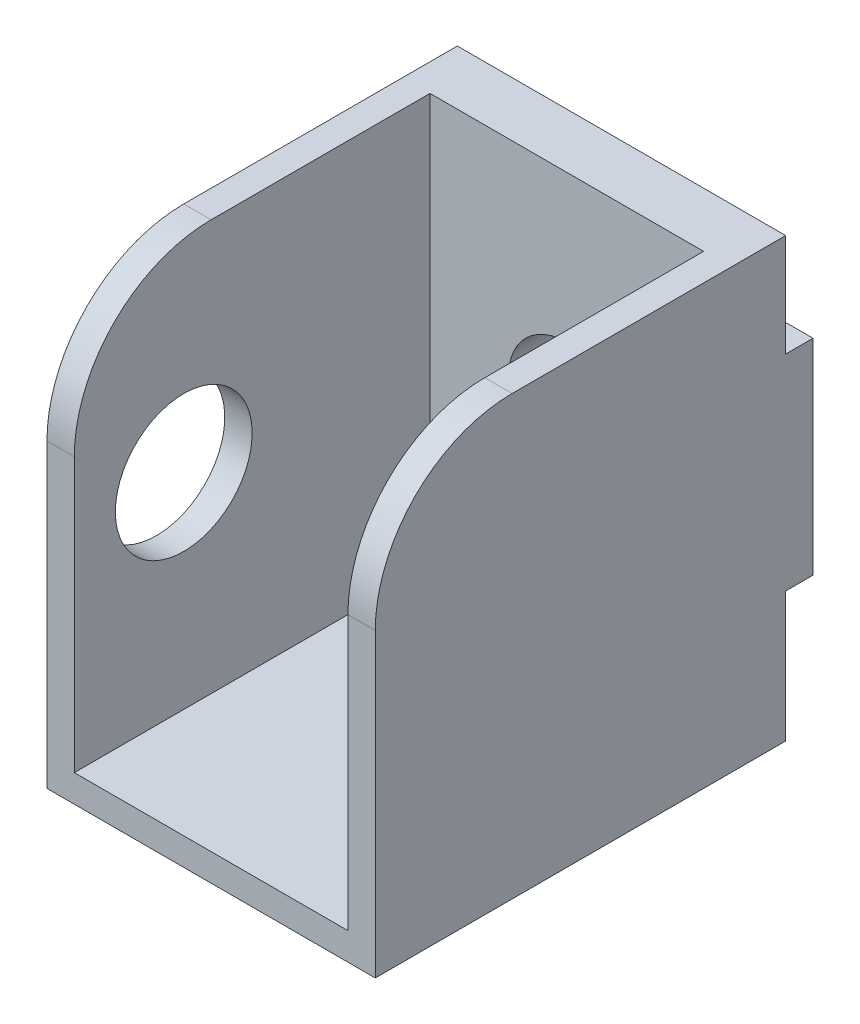
ISO-10303-21;
HEADER;
FILE_DESCRIPTION(('STEP AP214'),'2;1');
FILE_NAME('part.step','',(''),(''),'','','');
FILE_SCHEMA(('AUTOMOTIVE_DESIGN { 1 0 10303 214 1 1 1 1 }'));
ENDSEC;
DATA;
#1=APPLICATION_CONTEXT('core data for automotive mechanical design processes');
#2=APPLICATION_PROTOCOL_DEFINITION('international standard','automotive_design',2000,#1);
#3=PRODUCT_CONTEXT('',#1,'mechanical');
#4=PRODUCT('Part','Part','',(#3));
#5=PRODUCT_RELATED_PRODUCT_CATEGORY('part','',(#4));
#6=PRODUCT_DEFINITION_FORMATION('','',#4);
#7=PRODUCT_DEFINITION_CONTEXT('part definition',#1,'design');
#8=PRODUCT_DEFINITION('design','',#6,#7);
#9=PRODUCT_DEFINITION_SHAPE('','',#8);
#10=(LENGTH_UNIT() NAMED_UNIT(*) SI_UNIT(.MILLI.,.METRE.));
#11=(NAMED_UNIT(*) PLANE_ANGLE_UNIT() SI_UNIT($,.RADIAN.));
#12=(NAMED_UNIT(*) SI_UNIT($,.STERADIAN.) SOLID_ANGLE_UNIT());
#13=UNCERTAINTY_MEASURE_WITH_UNIT(LENGTH_MEASURE(1.E-05),#10,'distance_accuracy_value','');
#14=(GEOMETRIC_REPRESENTATION_CONTEXT(3) GLOBAL_UNCERTAINTY_ASSIGNED_CONTEXT((#13)) GLOBAL_UNIT_ASSIGNED_CONTEXT((#10,
#11,#12)) REPRESENTATION_CONTEXT('',''));
#15=CARTESIAN_POINT('',(0.,0.,0.));
#16=DIRECTION('',(0.,0.,1.));
#17=DIRECTION('',(1.,0.,0.));
#18=AXIS2_PLACEMENT_3D('',#15,#16,#17);
#19=CARTESIAN_POINT('',(0.,0.,0.));
#20=DIRECTION('',(0.,0.,-1.));
#21=DIRECTION('',(-1.,0.,0.));
#22=AXIS2_PLACEMENT_3D('',#19,#20,#21);
#23=PLANE('',#22);
#24=CARTESIAN_POINT('',(0.,0.,0.));
#25=DIRECTION('',(0.,0.,1.));
#26=DIRECTION('',(1.,0.,0.));
#27=AXIS2_PLACEMENT_3D('',#24,#25,#26);
#28=CIRCLE('',#27,4.25);
#29=CARTESIAN_POINT('',(4.25,0.,0.));
#30=VERTEX_POINT('',#29);
#31=EDGE_CURVE('E279',#30,#30,#28,.T.);
#32=ORIENTED_EDGE('',*,*,#31,.T.);
#33=EDGE_LOOP('',(#32));
#34=FACE_BOUND('',#33,.T.);
#35=DIRECTION('',(0.,-1.,0.));
#36=VECTOR('',#35,1.);
#37=CARTESIAN_POINT('',(-12.,15.,0.));
#38=LINE('',#37,#36);
#39=CARTESIAN_POINT('',(-12.,-7.50000000000001,0.));
#40=VERTEX_POINT('',#39);
#41=CARTESIAN_POINT('',(-12.,-17.,0.));
#42=VERTEX_POINT('',#41);
#43=EDGE_CURVE('E251',#40,#42,#38,.T.);
#44=ORIENTED_EDGE('',*,*,#43,.F.);
#45=DIRECTION('',(-1.,0.,0.));
#46=VECTOR('',#45,1.);
#47=CARTESIAN_POINT('',(-10.,-7.50000000000001,0.));
#48=LINE('',#47,#46);
#49=CARTESIAN_POINT('',(-10.,-7.50000000000001,0.));
#50=VERTEX_POINT('',#49);
#51=EDGE_CURVE('E342',#50,#40,#48,.T.);
#52=ORIENTED_EDGE('',*,*,#51,.F.);
#53=DIRECTION('',(0.,-1.,0.));
#54=VECTOR('',#53,1.);
#55=CARTESIAN_POINT('',(-10.,-7.50000000000001,0.));
#56=LINE('',#55,#54);
#57=CARTESIAN_POINT('',(-10.,7.49999999999999,0.));
#58=VERTEX_POINT('',#57);
#59=EDGE_CURVE('E179',#58,#50,#56,.T.);
#60=ORIENTED_EDGE('',*,*,#59,.F.);
#61=DIRECTION('',(1.,0.,0.));
#62=VECTOR('',#61,1.);
#63=CARTESIAN_POINT('',(-10.,7.49999999999999,0.));
#64=LINE('',#63,#62);
#65=CARTESIAN_POINT('',(-12.,7.49999999999999,0.));
#66=VERTEX_POINT('',#65);
#67=EDGE_CURVE('E175',#66,#58,#64,.T.);
#68=ORIENTED_EDGE('',*,*,#67,.F.);
#69=CARTESIAN_POINT('',(-12.,15.,0.));
#70=VERTEX_POINT('',#69);
#71=EDGE_CURVE('E247',#70,#66,#38,.T.);
#72=ORIENTED_EDGE('',*,*,#71,.F.);
#73=DIRECTION('',(-1.,0.,0.));
#74=VECTOR('',#73,1.);
#75=CARTESIAN_POINT('',(-10.,15.,0.));
#76=LINE('',#75,#74);
#77=CARTESIAN_POINT('',(12.,15.,0.));
#78=VERTEX_POINT('',#77);
#79=EDGE_CURVE('E37',#78,#70,#76,.T.);
#80=ORIENTED_EDGE('',*,*,#79,.F.);
#81=DIRECTION('',(0.,1.,0.));
#82=VECTOR('',#81,1.);
#83=CARTESIAN_POINT('',(12.,15.,0.));
#84=LINE('',#83,#82);
#85=CARTESIAN_POINT('',(12.,7.49999999999999,0.));
#86=VERTEX_POINT('',#85);
#87=EDGE_CURVE('E218',#86,#78,#84,.T.);
#88=ORIENTED_EDGE('',*,*,#87,.F.);
#89=DIRECTION('',(1.,0.,0.));
#90=VECTOR('',#89,1.);
#91=CARTESIAN_POINT('',(10.,7.49999999999999,0.));
#92=LINE('',#91,#90);
#93=CARTESIAN_POINT('',(10.,7.49999999999999,0.));
#94=VERTEX_POINT('',#93);
#95=EDGE_CURVE('E182',#94,#86,#92,.T.);
#96=ORIENTED_EDGE('',*,*,#95,.F.);
#97=DIRECTION('',(0.,1.,0.));
#98=VECTOR('',#97,1.);
#99=CARTESIAN_POINT('',(10.,-7.50000000000001,0.));
#100=LINE('',#99,#98);
#101=CARTESIAN_POINT('',(10.,-7.50000000000001,0.));
#102=VERTEX_POINT('',#101);
#103=EDGE_CURVE('E57',#102,#94,#100,.T.);
#104=ORIENTED_EDGE('',*,*,#103,.F.);
#105=DIRECTION('',(-1.,0.,0.));
#106=VECTOR('',#105,1.);
#107=CARTESIAN_POINT('',(10.,-7.50000000000001,0.));
#108=LINE('',#107,#106);
#109=CARTESIAN_POINT('',(12.,-7.5,0.));
#110=VERTEX_POINT('',#109);
#111=EDGE_CURVE('E192',#110,#102,#108,.T.);
#112=ORIENTED_EDGE('',*,*,#111,.F.);
#113=CARTESIAN_POINT('',(12.,-17.,0.));
#114=VERTEX_POINT('',#113);
#115=EDGE_CURVE('E214',#114,#110,#84,.T.);
#116=ORIENTED_EDGE('',*,*,#115,.F.);
#117=DIRECTION('',(1.,0.,0.));
#118=VECTOR('',#117,1.);
#119=CARTESIAN_POINT('',(10.,-17.,0.));
#120=LINE('',#119,#118);
#121=EDGE_CURVE('E276',#42,#114,#120,.T.);
#122=ORIENTED_EDGE('',*,*,#121,.F.);
#123=EDGE_LOOP('',(#44,#52,#60,#68,#72,#80,#88,#96,#104,#112,#116,#122));
#124=FACE_BOUND('',#123,.T.);
#125=ADVANCED_FACE('F33',(#34,#124),#23,.T.);
#126=CARTESIAN_POINT('',(0.,0.,4.));
#127=DIRECTION('',(0.,0.,-1.));
#128=DIRECTION('',(-1.,0.,0.));
#129=AXIS2_PLACEMENT_3D('',#126,#127,#128);
#130=PLANE('',#129);
#131=DIRECTION('',(0.,1.,0.));
#132=VECTOR('',#131,1.);
#133=CARTESIAN_POINT('',(10.,-15.,4.));
#134=LINE('',#133,#132);
#135=CARTESIAN_POINT('',(10.,-15.,4.));
#136=VERTEX_POINT('',#135);
#137=CARTESIAN_POINT('',(10.,15.,4.));
#138=VERTEX_POINT('',#137);
#139=EDGE_CURVE('E291',#136,#138,#134,.T.);
#140=ORIENTED_EDGE('',*,*,#139,.T.);
#141=DIRECTION('',(-1.,0.,0.));
#142=VECTOR('',#141,1.);
#143=CARTESIAN_POINT('',(-10.,15.,4.));
#144=LINE('',#143,#142);
#145=CARTESIAN_POINT('',(-10.,15.,4.));
#146=VERTEX_POINT('',#145);
#147=EDGE_CURVE('E294',#138,#146,#144,.T.);
#148=ORIENTED_EDGE('',*,*,#147,.T.);
#149=DIRECTION('',(0.,-1.,0.));
#150=VECTOR('',#149,1.);
#151=CARTESIAN_POINT('',(-10.,-15.,4.));
#152=LINE('',#151,#150);
#153=CARTESIAN_POINT('',(-10.,-15.,4.));
#154=VERTEX_POINT('',#153);
#155=EDGE_CURVE('E42',#146,#154,#152,.T.);
#156=ORIENTED_EDGE('',*,*,#155,.T.);
#157=DIRECTION('',(1.,0.,0.));
#158=VECTOR('',#157,1.);
#159=CARTESIAN_POINT('',(-10.,-15.,4.));
#160=LINE('',#159,#158);
#161=EDGE_CURVE('E11',#154,#136,#160,.T.);
#162=ORIENTED_EDGE('',*,*,#161,.T.);
#163=EDGE_LOOP('',(#140,#148,#156,#162));
#164=FACE_BOUND('',#163,.T.);
#165=CARTESIAN_POINT('',(0.,0.,4.));
#166=DIRECTION('',(0.,0.,1.));
#167=DIRECTION('',(1.,0.,0.));
#168=AXIS2_PLACEMENT_3D('',#165,#166,#167);
#169=CIRCLE('',#168,4.25);
#170=CARTESIAN_POINT('',(4.25,0.,4.));
#171=VERTEX_POINT('',#170);
#172=EDGE_CURVE('E286',#171,#171,#169,.T.);
#173=ORIENTED_EDGE('',*,*,#172,.F.);
#174=EDGE_LOOP('',(#173));
#175=FACE_BOUND('',#174,.T.);
#176=ADVANCED_FACE('F299',(#164,#175),#130,.F.);
#177=CARTESIAN_POINT('',(-10.,15.,4.));
#178=DIRECTION('',(0.,-1.,0.));
#179=DIRECTION('',(0.,0.,-1.));
#180=AXIS2_PLACEMENT_3D('',#177,#178,#179);
#181=PLANE('',#180);
#182=ORIENTED_EDGE('',*,*,#79,.T.);
#183=DIRECTION('',(0.,0.,-1.));
#184=VECTOR('',#183,1.);
#185=CARTESIAN_POINT('',(-12.,15.,0.));
#186=LINE('',#185,#184);
#187=CARTESIAN_POINT('',(-12.,15.,19.9999999999999));
#188=VERTEX_POINT('',#187);
#189=EDGE_CURVE('E258',#188,#70,#186,.T.);
#190=ORIENTED_EDGE('',*,*,#189,.F.);
#191=DIRECTION('',(1.,0.,0.));
#192=VECTOR('',#191,1.);
#193=CARTESIAN_POINT('',(-12.,15.,19.9999999999999));
#194=LINE('',#193,#192);
#195=CARTESIAN_POINT('',(-10.,15.,19.9999999999999));
#196=VERTEX_POINT('',#195);
#197=EDGE_CURVE('E261',#188,#196,#194,.T.);
#198=ORIENTED_EDGE('',*,*,#197,.T.);
#199=DIRECTION('',(0.,0.,-1.));
#200=VECTOR('',#199,1.);
#201=CARTESIAN_POINT('',(-10.,15.,0.));
#202=LINE('',#201,#200);
#203=EDGE_CURVE('E265',#196,#146,#202,.T.);
#204=ORIENTED_EDGE('',*,*,#203,.T.);
#205=ORIENTED_EDGE('',*,*,#147,.F.);
#206=DIRECTION('',(0.,0.,1.));
#207=VECTOR('',#206,1.);
#208=CARTESIAN_POINT('',(10.,15.,0.));
#209=LINE('',#208,#207);
#210=CARTESIAN_POINT('',(10.,15.,19.9999999999999));
#211=VERTEX_POINT('',#210);
#212=EDGE_CURVE('E213',#138,#211,#209,.T.);
#213=ORIENTED_EDGE('',*,*,#212,.T.);
#214=DIRECTION('',(-1.,0.,0.));
#215=VECTOR('',#214,1.);
#216=CARTESIAN_POINT('',(12.,15.,19.9999999999999));
#217=LINE('',#216,#215);
#218=CARTESIAN_POINT('',(12.,15.,19.9999999999999));
#219=VERTEX_POINT('',#218);
#220=EDGE_CURVE('E237',#219,#211,#217,.T.);
#221=ORIENTED_EDGE('',*,*,#220,.F.);
#222=DIRECTION('',(0.,0.,1.));
#223=VECTOR('',#222,1.);
#224=CARTESIAN_POINT('',(12.,15.,0.));
#225=LINE('',#224,#223);
#226=EDGE_CURVE('E217',#78,#219,#225,.T.);
#227=ORIENTED_EDGE('',*,*,#226,.F.);
#228=EDGE_LOOP('',(#182,#190,#198,#204,#205,#213,#221,#227));
#229=FACE_BOUND('',#228,.T.);
#230=ADVANCED_FACE('F35',(#229),#181,.F.);
#231=CARTESIAN_POINT('',(0.,0.,4.));
#232=DIRECTION('',(0.,0.,-1.));
#233=DIRECTION('',(-1.,0.,0.));
#234=AXIS2_PLACEMENT_3D('',#231,#232,#233);
#235=CYLINDRICAL_SURFACE('',#234,4.25);
#236=ORIENTED_EDGE('',*,*,#172,.T.);
#237=EDGE_LOOP('',(#236));
#238=FACE_BOUND('',#237,.T.);
#239=ORIENTED_EDGE('',*,*,#31,.F.);
#240=EDGE_LOOP('',(#239));
#241=FACE_BOUND('',#240,.T.);
#242=ADVANCED_FACE('F366',(#238,#241),#235,.F.);
#243=CARTESIAN_POINT('',(9.99999999999999,-17.,30.));
#244=DIRECTION('',(0.,0.,-1.));
#245=DIRECTION('',(-1.,0.,0.));
#246=AXIS2_PLACEMENT_3D('',#243,#244,#245);
#247=PLANE('',#246);
#248=DIRECTION('',(-1.,0.,0.));
#249=VECTOR('',#248,1.);
#250=CARTESIAN_POINT('',(9.99999999999999,-15.,30.));
#251=LINE('',#250,#249);
#252=CARTESIAN_POINT('',(10.,-15.,30.));
#253=VERTEX_POINT('',#252);
#254=CARTESIAN_POINT('',(-10.,-15.,30.));
#255=VERTEX_POINT('',#254);
#256=EDGE_CURVE('E282',#253,#255,#251,.T.);
#257=ORIENTED_EDGE('',*,*,#256,.T.);
#258=DIRECTION('',(0.,1.,0.));
#259=VECTOR('',#258,1.);
#260=CARTESIAN_POINT('',(-10.,4.99999999999992,30.));
#261=LINE('',#260,#259);
#262=CARTESIAN_POINT('',(-10.,4.99999999999992,30.));
#263=VERTEX_POINT('',#262);
#264=EDGE_CURVE('E244',#255,#263,#261,.T.);
#265=ORIENTED_EDGE('',*,*,#264,.T.);
#266=DIRECTION('',(1.,0.,0.));
#267=VECTOR('',#266,1.);
#268=CARTESIAN_POINT('',(-12.,4.99999999999992,30.));
#269=LINE('',#268,#267);
#270=CARTESIAN_POINT('',(-12.,4.99999999999992,30.));
#271=VERTEX_POINT('',#270);
#272=EDGE_CURVE('E270',#271,#263,#269,.T.);
#273=ORIENTED_EDGE('',*,*,#272,.F.);
#274=DIRECTION('',(0.,1.,0.));
#275=VECTOR('',#274,1.);
#276=CARTESIAN_POINT('',(-12.,4.99999999999992,30.));
#277=LINE('',#276,#275);
#278=CARTESIAN_POINT('',(-12.,-17.,30.));
#279=VERTEX_POINT('',#278);
#280=EDGE_CURVE('E254',#279,#271,#277,.T.);
#281=ORIENTED_EDGE('',*,*,#280,.F.);
#282=DIRECTION('',(-1.,0.,0.));
#283=VECTOR('',#282,1.);
#284=CARTESIAN_POINT('',(9.99999999999999,-17.,30.));
#285=LINE('',#284,#283);
#286=CARTESIAN_POINT('',(12.,-17.,30.));
#287=VERTEX_POINT('',#286);
#288=EDGE_CURVE('E274',#287,#279,#285,.T.);
#289=ORIENTED_EDGE('',*,*,#288,.F.);
#290=DIRECTION('',(0.,-1.,0.));
#291=VECTOR('',#290,1.);
#292=CARTESIAN_POINT('',(12.,4.99999999999992,30.));
#293=LINE('',#292,#291);
#294=CARTESIAN_POINT('',(12.,4.99999999999992,30.));
#295=VERTEX_POINT('',#294);
#296=EDGE_CURVE('E222',#295,#287,#293,.T.);
#297=ORIENTED_EDGE('',*,*,#296,.F.);
#298=DIRECTION('',(-1.,0.,0.));
#299=VECTOR('',#298,1.);
#300=CARTESIAN_POINT('',(12.,4.99999999999992,30.));
#301=LINE('',#300,#299);
#302=CARTESIAN_POINT('',(10.,4.99999999999992,30.));
#303=VERTEX_POINT('',#302);
#304=EDGE_CURVE('E228',#295,#303,#301,.T.);
#305=ORIENTED_EDGE('',*,*,#304,.T.);
#306=DIRECTION('',(0.,-1.,0.));
#307=VECTOR('',#306,1.);
#308=CARTESIAN_POINT('',(10.,4.99999999999992,30.));
#309=LINE('',#308,#307);
#310=EDGE_CURVE('E232',#303,#253,#309,.T.);
#311=ORIENTED_EDGE('',*,*,#310,.T.);
#312=EDGE_LOOP('',(#257,#265,#273,#281,#289,#297,#305,#311));
#313=FACE_BOUND('',#312,.T.);
#314=ADVANCED_FACE('F316',(#313),#247,.F.);
#315=CARTESIAN_POINT('',(0.,-17.,0.));
#316=DIRECTION('',(0.,-1.,0.));
#317=DIRECTION('',(0.,0.,-1.));
#318=AXIS2_PLACEMENT_3D('',#315,#316,#317);
#319=PLANE('',#318);
#320=ORIENTED_EDGE('',*,*,#121,.T.);
#321=DIRECTION('',(0.,0.,-1.));
#322=VECTOR('',#321,1.);
#323=CARTESIAN_POINT('',(12.,-17.,0.));
#324=LINE('',#323,#322);
#325=EDGE_CURVE('E225',#287,#114,#324,.T.);
#326=ORIENTED_EDGE('',*,*,#325,.F.);
#327=ORIENTED_EDGE('',*,*,#288,.T.);
#328=DIRECTION('',(0.,0.,1.));
#329=VECTOR('',#328,1.);
#330=CARTESIAN_POINT('',(-12.,-17.,0.));
#331=LINE('',#330,#329);
#332=EDGE_CURVE('E250',#42,#279,#331,.T.);
#333=ORIENTED_EDGE('',*,*,#332,.F.);
#334=EDGE_LOOP('',(#320,#326,#327,#333));
#335=FACE_BOUND('',#334,.T.);
#336=ADVANCED_FACE('F372',(#335),#319,.T.);
#337=CARTESIAN_POINT('',(0.,-15.,0.));
#338=DIRECTION('',(0.,-1.,0.));
#339=DIRECTION('',(0.,0.,-1.));
#340=AXIS2_PLACEMENT_3D('',#337,#338,#339);
#341=PLANE('',#340);
#342=ORIENTED_EDGE('',*,*,#161,.F.);
#343=DIRECTION('',(0.,0.,-1.));
#344=VECTOR('',#343,1.);
#345=CARTESIAN_POINT('',(-10.,-15.,0.));
#346=LINE('',#345,#344);
#347=EDGE_CURVE('E277',#255,#154,#346,.T.);
#348=ORIENTED_EDGE('',*,*,#347,.F.);
#349=ORIENTED_EDGE('',*,*,#256,.F.);
#350=DIRECTION('',(0.,0.,1.));
#351=VECTOR('',#350,1.);
#352=CARTESIAN_POINT('',(10.,-15.,0.));
#353=LINE('',#352,#351);
#354=EDGE_CURVE('E273',#136,#253,#353,.T.);
#355=ORIENTED_EDGE('',*,*,#354,.F.);
#356=EDGE_LOOP('',(#342,#348,#349,#355));
#357=FACE_BOUND('',#356,.T.);
#358=ADVANCED_FACE('F319',(#357),#341,.F.);
#359=CARTESIAN_POINT('',(-10.,4.99999999999999,20.));
#360=DIRECTION('',(-1.,0.,0.));
#361=DIRECTION('',(0.,0.,1.));
#362=AXIS2_PLACEMENT_3D('',#359,#360,#361);
#363=PLANE('',#362);
#364=CARTESIAN_POINT('',(-10.,0.,22.));
#365=DIRECTION('',(-1.,0.,0.));
#366=DIRECTION('',(0.,0.,1.));
#367=AXIS2_PLACEMENT_3D('',#364,#365,#366);
#368=CIRCLE('',#367,5.);
#369=CARTESIAN_POINT('',(-10.,0.,27.));
#370=VERTEX_POINT('',#369);
#371=EDGE_CURVE('E240',#370,#370,#368,.T.);
#372=ORIENTED_EDGE('',*,*,#371,.T.);
#373=EDGE_LOOP('',(#372));
#374=FACE_BOUND('',#373,.T.);
#375=ORIENTED_EDGE('',*,*,#264,.F.);
#376=ORIENTED_EDGE('',*,*,#347,.T.);
#377=ORIENTED_EDGE('',*,*,#155,.F.);
#378=ORIENTED_EDGE('',*,*,#203,.F.);
#379=CARTESIAN_POINT('',(-10.,4.99999999999999,20.));
#380=DIRECTION('',(-1.,0.,0.));
#381=DIRECTION('',(0.,0.,1.));
#382=AXIS2_PLACEMENT_3D('',#379,#380,#381);
#383=CIRCLE('',#382,10.);
#384=EDGE_CURVE('E263',#263,#196,#383,.T.);
#385=ORIENTED_EDGE('',*,*,#384,.F.);
#386=EDGE_LOOP('',(#375,#376,#377,#378,#385));
#387=FACE_BOUND('',#386,.T.);
#388=ADVANCED_FACE('F305',(#374,#387),#363,.F.);
#389=CARTESIAN_POINT('',(-12.,4.99999999999999,20.));
#390=DIRECTION('',(-1.,0.,0.));
#391=DIRECTION('',(0.,0.,1.));
#392=AXIS2_PLACEMENT_3D('',#389,#390,#391);
#393=PLANE('',#392);
#394=ORIENTED_EDGE('',*,*,#71,.T.);
#395=DIRECTION('',(0.,0.,1.));
#396=VECTOR('',#395,1.);
#397=CARTESIAN_POINT('',(-12.,7.49999999999999,-2.));
#398=LINE('',#397,#396);
#399=CARTESIAN_POINT('',(-12.,7.49999999999999,-2.));
#400=VERTEX_POINT('',#399);
#401=EDGE_CURVE('E184',#400,#66,#398,.T.);
#402=ORIENTED_EDGE('',*,*,#401,.F.);
#403=DIRECTION('',(0.,1.,0.));
#404=VECTOR('',#403,1.);
#405=CARTESIAN_POINT('',(-12.,-7.5,-2.));
#406=LINE('',#405,#404);
#407=CARTESIAN_POINT('',(-12.,-7.5,-2.));
#408=VERTEX_POINT('',#407);
#409=EDGE_CURVE('E165',#408,#400,#406,.T.);
#410=ORIENTED_EDGE('',*,*,#409,.F.);
#411=DIRECTION('',(0.,0.,1.));
#412=VECTOR('',#411,1.);
#413=CARTESIAN_POINT('',(-12.,-7.5,-2.));
#414=LINE('',#413,#412);
#415=EDGE_CURVE('E49',#408,#40,#414,.T.);
#416=ORIENTED_EDGE('',*,*,#415,.T.);
#417=ORIENTED_EDGE('',*,*,#43,.T.);
#418=ORIENTED_EDGE('',*,*,#332,.T.);
#419=ORIENTED_EDGE('',*,*,#280,.T.);
#420=CARTESIAN_POINT('',(-12.,4.99999999999999,20.));
#421=DIRECTION('',(-1.,0.,0.));
#422=DIRECTION('',(0.,0.,1.));
#423=AXIS2_PLACEMENT_3D('',#420,#421,#422);
#424=CIRCLE('',#423,10.);
#425=EDGE_CURVE('E256',#271,#188,#424,.T.);
#426=ORIENTED_EDGE('',*,*,#425,.T.);
#427=ORIENTED_EDGE('',*,*,#189,.T.);
#428=EDGE_LOOP('',(#394,#402,#410,#416,#417,#418,#419,#426,#427));
#429=FACE_BOUND('',#428,.T.);
#430=CARTESIAN_POINT('',(-12.,0.,22.));
#431=DIRECTION('',(-1.,0.,0.));
#432=DIRECTION('',(0.,0.,1.));
#433=AXIS2_PLACEMENT_3D('',#430,#431,#432);
#434=CIRCLE('',#433,5.);
#435=CARTESIAN_POINT('',(-12.,0.,27.));
#436=VERTEX_POINT('',#435);
#437=EDGE_CURVE('E241',#436,#436,#434,.T.);
#438=ORIENTED_EDGE('',*,*,#437,.F.);
#439=EDGE_LOOP('',(#438));
#440=FACE_BOUND('',#439,.T.);
#441=ADVANCED_FACE('F336',(#429,#440),#393,.T.);
#442=CARTESIAN_POINT('',(-12.,4.99999999999999,20.));
#443=DIRECTION('',(1.,0.,0.));
#444=DIRECTION('',(0.,0.,-1.));
#445=AXIS2_PLACEMENT_3D('',#442,#443,#444);
#446=CYLINDRICAL_SURFACE('',#445,10.);
#447=ORIENTED_EDGE('',*,*,#384,.T.);
#448=ORIENTED_EDGE('',*,*,#197,.F.);
#449=ORIENTED_EDGE('',*,*,#425,.F.);
#450=ORIENTED_EDGE('',*,*,#272,.T.);
#451=EDGE_LOOP('',(#447,#448,#449,#450));
#452=FACE_BOUND('',#451,.T.);
#453=ADVANCED_FACE('F313',(#452),#446,.T.);
#454=CARTESIAN_POINT('',(-12.,0.,22.));
#455=DIRECTION('',(1.,0.,0.));
#456=DIRECTION('',(0.,0.,-1.));
#457=AXIS2_PLACEMENT_3D('',#454,#455,#456);
#458=CYLINDRICAL_SURFACE('',#457,5.);
#459=ORIENTED_EDGE('',*,*,#437,.T.);
#460=EDGE_LOOP('',(#459));
#461=FACE_BOUND('',#460,.T.);
#462=ORIENTED_EDGE('',*,*,#371,.F.);
#463=EDGE_LOOP('',(#462));
#464=FACE_BOUND('',#463,.T.);
#465=ADVANCED_FACE('F380',(#461,#464),#458,.F.);
#466=CARTESIAN_POINT('',(10.,4.99999999999999,20.));
#467=DIRECTION('',(-1.,0.,0.));
#468=DIRECTION('',(0.,0.,1.));
#469=AXIS2_PLACEMENT_3D('',#466,#467,#468);
#470=PLANE('',#469);
#471=ORIENTED_EDGE('',*,*,#139,.F.);
#472=ORIENTED_EDGE('',*,*,#354,.T.);
#473=ORIENTED_EDGE('',*,*,#310,.F.);
#474=CARTESIAN_POINT('',(10.,4.99999999999999,20.));
#475=DIRECTION('',(1.,0.,0.));
#476=DIRECTION('',(0.,0.,1.));
#477=AXIS2_PLACEMENT_3D('',#474,#475,#476);
#478=CIRCLE('',#477,10.);
#479=EDGE_CURVE('E230',#211,#303,#478,.T.);
#480=ORIENTED_EDGE('',*,*,#479,.F.);
#481=ORIENTED_EDGE('',*,*,#212,.F.);
#482=EDGE_LOOP('',(#471,#472,#473,#480,#481));
#483=FACE_BOUND('',#482,.T.);
#484=ADVANCED_FACE('F321',(#483),#470,.T.);
#485=CARTESIAN_POINT('',(12.,4.99999999999999,20.));
#486=DIRECTION('',(-1.,0.,0.));
#487=DIRECTION('',(0.,0.,1.));
#488=AXIS2_PLACEMENT_3D('',#485,#486,#487);
#489=CYLINDRICAL_SURFACE('',#488,10.);
#490=ORIENTED_EDGE('',*,*,#479,.T.);
#491=ORIENTED_EDGE('',*,*,#304,.F.);
#492=CARTESIAN_POINT('',(12.,4.99999999999999,20.));
#493=DIRECTION('',(1.,0.,0.));
#494=DIRECTION('',(0.,0.,1.));
#495=AXIS2_PLACEMENT_3D('',#492,#493,#494);
#496=CIRCLE('',#495,10.);
#497=EDGE_CURVE('E220',#219,#295,#496,.T.);
#498=ORIENTED_EDGE('',*,*,#497,.F.);
#499=ORIENTED_EDGE('',*,*,#220,.T.);
#500=EDGE_LOOP('',(#490,#491,#498,#499));
#501=FACE_BOUND('',#500,.T.);
#502=ADVANCED_FACE('F328',(#501),#489,.T.);
#503=CARTESIAN_POINT('',(12.,4.99999999999999,20.));
#504=DIRECTION('',(-1.,0.,0.));
#505=DIRECTION('',(0.,0.,1.));
#506=AXIS2_PLACEMENT_3D('',#503,#504,#505);
#507=PLANE('',#506);
#508=ORIENTED_EDGE('',*,*,#115,.T.);
#509=DIRECTION('',(0.,0.,1.));
#510=VECTOR('',#509,1.);
#511=CARTESIAN_POINT('',(12.,-7.5,-2.));
#512=LINE('',#511,#510);
#513=CARTESIAN_POINT('',(12.,-7.5,-2.));
#514=VERTEX_POINT('',#513);
#515=EDGE_CURVE('E204',#514,#110,#512,.T.);
#516=ORIENTED_EDGE('',*,*,#515,.F.);
#517=DIRECTION('',(0.,-1.,0.));
#518=VECTOR('',#517,1.);
#519=CARTESIAN_POINT('',(12.,-7.5,-2.));
#520=LINE('',#519,#518);
#521=CARTESIAN_POINT('',(12.,7.49999999999999,-2.));
#522=VERTEX_POINT('',#521);
#523=EDGE_CURVE('E194',#522,#514,#520,.T.);
#524=ORIENTED_EDGE('',*,*,#523,.F.);
#525=DIRECTION('',(0.,0.,1.));
#526=VECTOR('',#525,1.);
#527=CARTESIAN_POINT('',(12.,7.49999999999999,-2.));
#528=LINE('',#527,#526);
#529=EDGE_CURVE('E207',#522,#86,#528,.T.);
#530=ORIENTED_EDGE('',*,*,#529,.T.);
#531=ORIENTED_EDGE('',*,*,#87,.T.);
#532=ORIENTED_EDGE('',*,*,#226,.T.);
#533=ORIENTED_EDGE('',*,*,#497,.T.);
#534=ORIENTED_EDGE('',*,*,#296,.T.);
#535=ORIENTED_EDGE('',*,*,#325,.T.);
#536=EDGE_LOOP('',(#508,#516,#524,#530,#531,#532,#533,#534,#535));
#537=FACE_BOUND('',#536,.T.);
#538=ADVANCED_FACE('F332',(#537),#507,.F.);
#539=CARTESIAN_POINT('',(10.,-7.50000000000001,-2.));
#540=DIRECTION('',(1.,0.,0.));
#541=DIRECTION('',(0.,0.,-1.));
#542=AXIS2_PLACEMENT_3D('',#539,#540,#541);
#543=PLANE('',#542);
#544=ORIENTED_EDGE('',*,*,#103,.T.);
#545=DIRECTION('',(0.,0.,1.));
#546=VECTOR('',#545,1.);
#547=CARTESIAN_POINT('',(10.,7.49999999999999,-2.));
#548=LINE('',#547,#546);
#549=CARTESIAN_POINT('',(10.,7.49999999999999,-2.));
#550=VERTEX_POINT('',#549);
#551=EDGE_CURVE('E210',#550,#94,#548,.T.);
#552=ORIENTED_EDGE('',*,*,#551,.F.);
#553=DIRECTION('',(0.,1.,0.));
#554=VECTOR('',#553,1.);
#555=CARTESIAN_POINT('',(10.,-7.50000000000001,-2.));
#556=LINE('',#555,#554);
#557=CARTESIAN_POINT('',(10.,-7.50000000000001,-2.));
#558=VERTEX_POINT('',#557);
#559=EDGE_CURVE('E188',#558,#550,#556,.T.);
#560=ORIENTED_EDGE('',*,*,#559,.F.);
#561=DIRECTION('',(0.,0.,1.));
#562=VECTOR('',#561,1.);
#563=CARTESIAN_POINT('',(10.,-7.50000000000001,-2.));
#564=LINE('',#563,#562);
#565=EDGE_CURVE('E197',#558,#102,#564,.T.);
#566=ORIENTED_EDGE('',*,*,#565,.T.);
#567=EDGE_LOOP('',(#544,#552,#560,#566));
#568=FACE_BOUND('',#567,.T.);
#569=ADVANCED_FACE('F395',(#568),#543,.F.);
#570=CARTESIAN_POINT('',(10.,7.49999999999999,-2.));
#571=DIRECTION('',(0.,-1.,0.));
#572=DIRECTION('',(0.,0.,-1.));
#573=AXIS2_PLACEMENT_3D('',#570,#571,#572);
#574=PLANE('',#573);
#575=ORIENTED_EDGE('',*,*,#95,.T.);
#576=ORIENTED_EDGE('',*,*,#529,.F.);
#577=DIRECTION('',(1.,0.,0.));
#578=VECTOR('',#577,1.);
#579=CARTESIAN_POINT('',(10.,7.49999999999999,-2.));
#580=LINE('',#579,#578);
#581=EDGE_CURVE('E191',#550,#522,#580,.T.);
#582=ORIENTED_EDGE('',*,*,#581,.F.);
#583=ORIENTED_EDGE('',*,*,#551,.T.);
#584=EDGE_LOOP('',(#575,#576,#582,#583));
#585=FACE_BOUND('',#584,.T.);
#586=ADVANCED_FACE('F398',(#585),#574,.F.);
#587=CARTESIAN_POINT('',(10.,-7.50000000000001,-2.));
#588=DIRECTION('',(0.,1.,0.));
#589=DIRECTION('',(-1.,0.,0.));
#590=AXIS2_PLACEMENT_3D('',#587,#588,#589);
#591=PLANE('',#590);
#592=ORIENTED_EDGE('',*,*,#111,.T.);
#593=ORIENTED_EDGE('',*,*,#565,.F.);
#594=DIRECTION('',(-1.,0.,0.));
#595=VECTOR('',#594,1.);
#596=CARTESIAN_POINT('',(10.,-7.50000000000001,-2.));
#597=LINE('',#596,#595);
#598=EDGE_CURVE('E196',#514,#558,#597,.T.);
#599=ORIENTED_EDGE('',*,*,#598,.F.);
#600=ORIENTED_EDGE('',*,*,#515,.T.);
#601=EDGE_LOOP('',(#592,#593,#599,#600));
#602=FACE_BOUND('',#601,.T.);
#603=ADVANCED_FACE('F402',(#602),#591,.F.);
#604=CARTESIAN_POINT('',(0.,0.,-2.));
#605=DIRECTION('',(0.,0.,-1.));
#606=DIRECTION('',(-1.,0.,0.));
#607=AXIS2_PLACEMENT_3D('',#604,#605,#606);
#608=PLANE('',#607);
#609=ORIENTED_EDGE('',*,*,#559,.T.);
#610=ORIENTED_EDGE('',*,*,#581,.T.);
#611=ORIENTED_EDGE('',*,*,#523,.T.);
#612=ORIENTED_EDGE('',*,*,#598,.T.);
#613=EDGE_LOOP('',(#609,#610,#611,#612));
#614=FACE_BOUND('',#613,.T.);
#615=ADVANCED_FACE('F406',(#614),#608,.T.);
#616=CARTESIAN_POINT('',(-10.,-7.50000000000001,-2.));
#617=DIRECTION('',(-1.,0.,0.));
#618=DIRECTION('',(0.,0.,1.));
#619=AXIS2_PLACEMENT_3D('',#616,#617,#618);
#620=PLANE('',#619);
#621=ORIENTED_EDGE('',*,*,#59,.T.);
#622=DIRECTION('',(0.,0.,1.));
#623=VECTOR('',#622,1.);
#624=CARTESIAN_POINT('',(-10.,-7.50000000000001,-2.));
#625=LINE('',#624,#623);
#626=CARTESIAN_POINT('',(-10.,-7.50000000000001,-2.));
#627=VERTEX_POINT('',#626);
#628=EDGE_CURVE('E162',#627,#50,#625,.T.);
#629=ORIENTED_EDGE('',*,*,#628,.F.);
#630=DIRECTION('',(0.,-1.,0.));
#631=VECTOR('',#630,1.);
#632=CARTESIAN_POINT('',(-10.,-7.50000000000001,-2.));
#633=LINE('',#632,#631);
#634=CARTESIAN_POINT('',(-10.,7.49999999999999,-2.));
#635=VERTEX_POINT('',#634);
#636=EDGE_CURVE('E166',#635,#627,#633,.T.);
#637=ORIENTED_EDGE('',*,*,#636,.F.);
#638=DIRECTION('',(0.,0.,1.));
#639=VECTOR('',#638,1.);
#640=CARTESIAN_POINT('',(-10.,7.49999999999999,-2.));
#641=LINE('',#640,#639);
#642=EDGE_CURVE('E347',#635,#58,#641,.T.);
#643=ORIENTED_EDGE('',*,*,#642,.T.);
#644=EDGE_LOOP('',(#621,#629,#637,#643));
#645=FACE_BOUND('',#644,.T.);
#646=ADVANCED_FACE('F177',(#645),#620,.F.);
#647=CARTESIAN_POINT('',(-10.,-7.50000000000001,-2.));
#648=DIRECTION('',(0.,1.,0.));
#649=DIRECTION('',(-1.,0.,0.));
#650=AXIS2_PLACEMENT_3D('',#647,#648,#649);
#651=PLANE('',#650);
#652=ORIENTED_EDGE('',*,*,#51,.T.);
#653=ORIENTED_EDGE('',*,*,#415,.F.);
#654=DIRECTION('',(-1.,0.,0.));
#655=VECTOR('',#654,1.);
#656=CARTESIAN_POINT('',(-10.,-7.50000000000001,-2.));
#657=LINE('',#656,#655);
#658=EDGE_CURVE('E158',#627,#408,#657,.T.);
#659=ORIENTED_EDGE('',*,*,#658,.F.);
#660=ORIENTED_EDGE('',*,*,#628,.T.);
#661=EDGE_LOOP('',(#652,#653,#659,#660));
#662=FACE_BOUND('',#661,.T.);
#663=ADVANCED_FACE('F160',(#662),#651,.F.);
#664=CARTESIAN_POINT('',(-10.,7.49999999999999,-2.));
#665=DIRECTION('',(0.,-1.,0.));
#666=DIRECTION('',(0.,0.,-1.));
#667=AXIS2_PLACEMENT_3D('',#664,#665,#666);
#668=PLANE('',#667);
#669=ORIENTED_EDGE('',*,*,#67,.T.);
#670=ORIENTED_EDGE('',*,*,#642,.F.);
#671=DIRECTION('',(1.,0.,0.));
#672=VECTOR('',#671,1.);
#673=CARTESIAN_POINT('',(-10.,7.49999999999999,-2.));
#674=LINE('',#673,#672);
#675=EDGE_CURVE('E171',#400,#635,#674,.T.);
#676=ORIENTED_EDGE('',*,*,#675,.F.);
#677=ORIENTED_EDGE('',*,*,#401,.T.);
#678=EDGE_LOOP('',(#669,#670,#676,#677));
#679=FACE_BOUND('',#678,.T.);
#680=ADVANCED_FACE('F348',(#679),#668,.F.);
#681=CARTESIAN_POINT('',(0.,0.,-2.));
#682=DIRECTION('',(0.,0.,1.));
#683=DIRECTION('',(1.,0.,0.));
#684=AXIS2_PLACEMENT_3D('',#681,#682,#683);
#685=PLANE('',#684);
#686=ORIENTED_EDGE('',*,*,#636,.T.);
#687=ORIENTED_EDGE('',*,*,#658,.T.);
#688=ORIENTED_EDGE('',*,*,#409,.T.);
#689=ORIENTED_EDGE('',*,*,#675,.T.);
#690=EDGE_LOOP('',(#686,#687,#688,#689));
#691=FACE_BOUND('',#690,.T.);
#692=ADVANCED_FACE('F169',(#691),#685,.F.);
#693=CLOSED_SHELL('',(#125,#176,#230,#242,#314,#336,#358,#388,#441,#453,#465,#484,#502,#538,
#569,#586,#603,#615,#646,#663,#680,#692));
#694=MANIFOLD_SOLID_BREP('B2',#693);
#695=ADVANCED_BREP_SHAPE_REPRESENTATION('',(#18,#694),#14);
#696=SHAPE_DEFINITION_REPRESENTATION(#9,#695);
ENDSEC;
END-ISO-10303-21;
